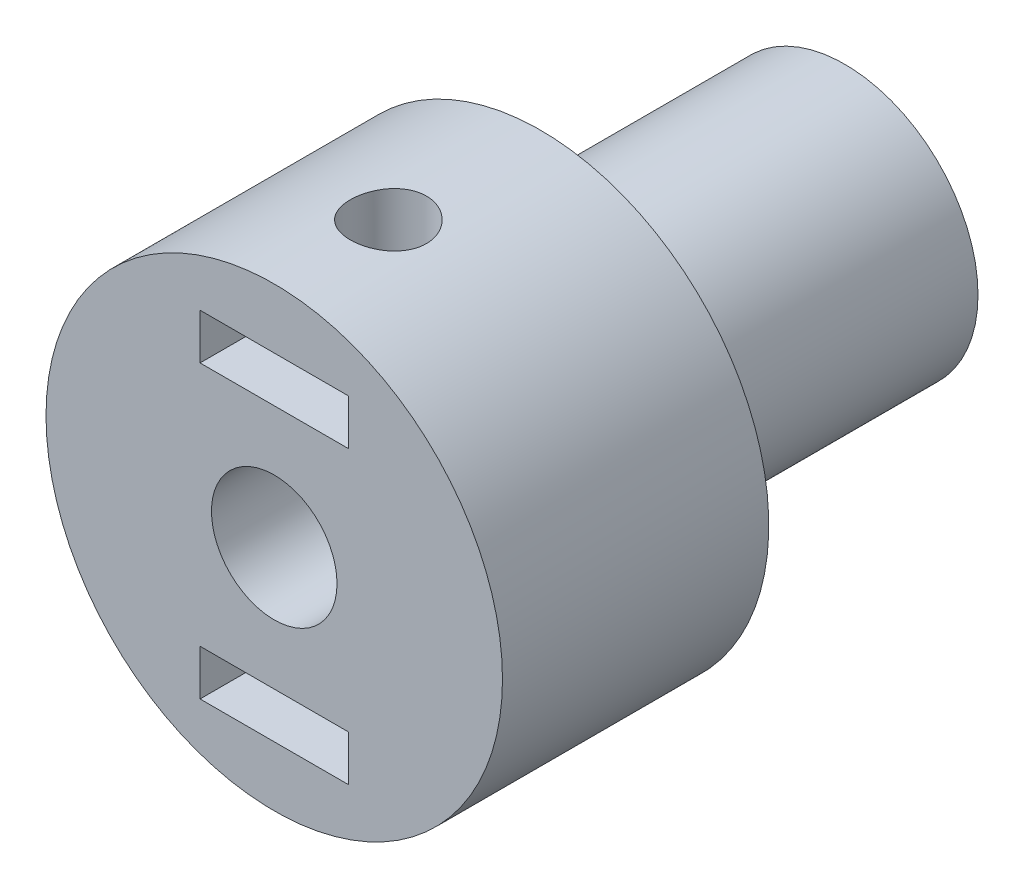
ISO-10303-21;
HEADER;
FILE_DESCRIPTION(('STEP AP214'),'2;1');
FILE_NAME('part.step','',(''),(''),'','','');
FILE_SCHEMA(('AUTOMOTIVE_DESIGN { 1 0 10303 214 1 1 1 1 }'));
ENDSEC;
DATA;
#1=APPLICATION_CONTEXT('core data for automotive mechanical design processes');
#2=APPLICATION_PROTOCOL_DEFINITION('international standard','automotive_design',2000,#1);
#3=PRODUCT_CONTEXT('',#1,'mechanical');
#4=PRODUCT('Part','Part','',(#3));
#5=PRODUCT_RELATED_PRODUCT_CATEGORY('part','',(#4));
#6=PRODUCT_DEFINITION_FORMATION('','',#4);
#7=PRODUCT_DEFINITION_CONTEXT('part definition',#1,'design');
#8=PRODUCT_DEFINITION('design','',#6,#7);
#9=PRODUCT_DEFINITION_SHAPE('','',#8);
#10=(LENGTH_UNIT() NAMED_UNIT(*) SI_UNIT(.MILLI.,.METRE.));
#11=(NAMED_UNIT(*) PLANE_ANGLE_UNIT() SI_UNIT($,.RADIAN.));
#12=(NAMED_UNIT(*) SI_UNIT($,.STERADIAN.) SOLID_ANGLE_UNIT());
#13=UNCERTAINTY_MEASURE_WITH_UNIT(LENGTH_MEASURE(1.E-05),#10,'distance_accuracy_value','');
#14=(GEOMETRIC_REPRESENTATION_CONTEXT(3) GLOBAL_UNCERTAINTY_ASSIGNED_CONTEXT((#13)) GLOBAL_UNIT_ASSIGNED_CONTEXT((#10,
#11,#12)) REPRESENTATION_CONTEXT('',''));
#15=CARTESIAN_POINT('',(0.,0.,0.));
#16=DIRECTION('',(0.,0.,1.));
#17=DIRECTION('',(1.,0.,0.));
#18=AXIS2_PLACEMENT_3D('',#15,#16,#17);
#19=CARTESIAN_POINT('',(0.,0.,15.));
#20=DIRECTION('',(0.,0.,-1.));
#21=DIRECTION('',(-1.,0.,0.));
#22=AXIS2_PLACEMENT_3D('',#19,#20,#21);
#23=CYLINDRICAL_SURFACE('',#22,6.);
#24=CARTESIAN_POINT('',(0.,0.,15.));
#25=DIRECTION('',(0.,0.,1.));
#26=DIRECTION('',(1.,0.,0.));
#27=AXIS2_PLACEMENT_3D('',#24,#25,#26);
#28=CIRCLE('',#27,6.);
#29=CARTESIAN_POINT('',(6.,0.,15.));
#30=VERTEX_POINT('',#29);
#31=EDGE_CURVE('E11',#30,#30,#28,.T.);
#32=ORIENTED_EDGE('',*,*,#31,.F.);
#33=EDGE_LOOP('',(#32));
#34=FACE_BOUND('',#33,.T.);
#35=CARTESIAN_POINT('',(0.,6.,13.));
#36=CARTESIAN_POINT('',(-0.0557563619832858,5.9999990446753,12.9999977644209));
#37=CARTESIAN_POINT('',(-0.111543152735528,5.99921471165214,12.9953210900124));
#38=CARTESIAN_POINT('',(-0.221552088669217,5.99616137976555,12.9767457364939));
#39=CARTESIAN_POINT('',(-0.275772747183699,5.99389101569556,12.9628385772354));
#40=CARTESIAN_POINT('',(-0.381041898885058,5.9881202729458,12.9262338205629));
#41=CARTESIAN_POINT('',(-0.432092947372761,5.98462090063677,12.9035434137438));
#42=CARTESIAN_POINT('',(-0.529656736791179,5.97677690832828,12.850035083179));
#43=CARTESIAN_POINT('',(-0.576169995951437,5.97243238501774,12.8192180890068));
#44=CARTESIAN_POINT('',(-0.663789045716672,5.96333326983325,12.7500179664718));
#45=CARTESIAN_POINT('',(-0.704845161413987,5.95857548725943,12.7115723541455));
#46=CARTESIAN_POINT('',(-0.779955399463972,5.94921050750693,12.6283408126109));
#47=CARTESIAN_POINT('',(-0.814009079756389,5.94460331985067,12.5835544834174));
#48=CARTESIAN_POINT('',(-0.874346850242054,5.93603026303912,12.4885716135212));
#49=CARTESIAN_POINT('',(-0.900581821144401,5.93206851636655,12.4383434652781));
#50=CARTESIAN_POINT('',(-0.944223346164488,5.9252791591787,12.3341161742797));
#51=CARTESIAN_POINT('',(-0.961630496626246,5.92245147205723,12.2801172865289));
#52=CARTESIAN_POINT('',(-0.986965751113924,5.91828214737102,12.1704078900574));
#53=CARTESIAN_POINT('',(-0.994979611654161,5.9169270739428,12.1147177053994));
#54=CARTESIAN_POINT('',(-1.00156669011595,5.9158157557466,12.0027678892466));
#55=CARTESIAN_POINT('',(-1.0001405761556,5.91605939782886,11.9465082983331));
#56=CARTESIAN_POINT('',(-0.987958039358461,5.91810571545422,11.8356288554898));
#57=CARTESIAN_POINT('',(-0.97729795275591,5.91989229327567,11.7809980785819));
#58=CARTESIAN_POINT('',(-0.947101256161378,5.92479798084403,11.6743114728683));
#59=CARTESIAN_POINT('',(-0.927564341727897,5.92791713629309,11.6222557324446));
#60=CARTESIAN_POINT('',(-0.880070898437566,5.9351539173364,11.5219084706236));
#61=CARTESIAN_POINT('',(-0.852074365551886,5.9392762684293,11.4736362375675));
#62=CARTESIAN_POINT('',(-0.788484807022973,5.94805167366004,11.3824382397846));
#63=CARTESIAN_POINT('',(-0.752891168261715,5.95270477061715,11.339512907018));
#64=CARTESIAN_POINT('',(-0.674592884863621,5.96208811151914,11.2596695656771));
#65=CARTESIAN_POINT('',(-0.631805585549251,5.96681859692661,11.222832592584));
#66=CARTESIAN_POINT('',(-0.540614099592659,5.97577040558689,11.1568488949339));
#67=CARTESIAN_POINT('',(-0.492209876762569,5.97999172555898,11.1277022199267));
#68=CARTESIAN_POINT('',(-0.391082366466685,5.98745557157165,11.0779191091455));
#69=CARTESIAN_POINT('',(-0.338355490225865,5.99069727362979,11.0572898322675));
#70=CARTESIAN_POINT('',(-0.230119338241093,5.99583001205064,11.0252023139016));
#71=CARTESIAN_POINT('',(-0.174610295671787,5.9977211614019,11.0137433052105));
#72=CARTESIAN_POINT('',(-0.063083960520649,5.99992451937074,11.0004314566155));
#73=CARTESIAN_POINT('',(-0.00708029486040398,6.00025501205114,10.9984673712778));
#74=CARTESIAN_POINT('',(0.104455909155955,5.99934989768468,11.0039045377712));
#75=CARTESIAN_POINT('',(0.159988465556816,5.99811435089647,11.0113054292535));
#76=CARTESIAN_POINT('',(0.268662470218706,5.99422730775281,11.0351699397342));
#77=CARTESIAN_POINT('',(0.321816347354152,5.99158441920524,11.051578483356));
#78=CARTESIAN_POINT('',(0.424618753944177,5.98517785782144,11.0929338072798));
#79=CARTESIAN_POINT('',(0.474267086363888,5.98141412204808,11.1178810670541));
#80=CARTESIAN_POINT('',(0.569132275787584,5.97313806520963,11.1758604498787));
#81=CARTESIAN_POINT('',(0.614306100374859,5.96861942354809,11.2089620624669));
#82=CARTESIAN_POINT('',(0.698497434201076,5.9593538695676,11.282214926154));
#83=CARTESIAN_POINT('',(0.737514495878634,5.95460694068619,11.3223666893107));
#84=CARTESIAN_POINT('',(0.808697111863201,5.94536070094338,11.4090790192286));
#85=CARTESIAN_POINT('',(0.840787504445486,5.94086446454842,11.4557016662058));
#86=CARTESIAN_POINT('',(0.896680924117994,5.93268611911154,11.5537411876554));
#87=CARTESIAN_POINT('',(0.920484213907929,5.92900398426408,11.605157910091));
#88=CARTESIAN_POINT('',(0.95901533258926,5.92289381479082,11.7111158931249));
#89=CARTESIAN_POINT('',(0.973780573019179,5.92046061724426,11.7656432380122));
#90=CARTESIAN_POINT('',(0.993934181511311,5.91711086734105,11.8764480516887));
#91=CARTESIAN_POINT('',(0.999323364778468,5.91619418313089,11.9327253678928));
#92=CARTESIAN_POINT('',(1.00054914641894,5.91598693233605,12.044682066385));
#93=CARTESIAN_POINT('',(0.996504054450075,5.9166762260226,12.1003601514301));
#94=CARTESIAN_POINT('',(0.97923193558274,5.91955912581491,12.2102316992203));
#95=CARTESIAN_POINT('',(0.966004938444991,5.92175272704486,12.2644251667767));
#96=CARTESIAN_POINT('',(0.930789795837961,5.92738942512688,12.369743374917));
#97=CARTESIAN_POINT('',(0.908811836240178,5.93083106887868,12.4208716040224));
#98=CARTESIAN_POINT('',(0.856730801566365,5.93857747568883,12.5187342676779));
#99=CARTESIAN_POINT('',(0.826627323499426,5.9428822815536,12.5654684841489));
#100=CARTESIAN_POINT('',(0.758727553748862,5.95193381618249,12.6538142332431));
#101=CARTESIAN_POINT('',(0.720844225437459,5.95668518230521,12.6953584066801));
#102=CARTESIAN_POINT('',(0.638643612552092,5.96605748944336,12.77154064179));
#103=CARTESIAN_POINT('',(0.594324845165055,5.97067840010619,12.8061771074553));
#104=CARTESIAN_POINT('',(0.500147667856113,5.97930611856888,12.86777930728));
#105=CARTESIAN_POINT('',(0.450253115013127,5.98330846501242,12.8946904157252));
#106=CARTESIAN_POINT('',(0.346605227751592,5.9902046704071,12.939707793844));
#107=CARTESIAN_POINT('',(0.292855797932004,5.99309963270993,12.9578228324319));
#108=CARTESIAN_POINT('',(0.19908132401816,5.99682316333182,12.9808021096507));
#109=CARTESIAN_POINT('',(0.159623532119379,5.99800810909344,12.9879897878464));
#110=CARTESIAN_POINT('',(0.0801157241279235,5.99959686394448,12.9975894951379));
#111=CARTESIAN_POINT('',(0.0400657182433976,6.00000068648257,13.0000016064549));
#112=CARTESIAN_POINT('',(0.,6.,13.));
#113=B_SPLINE_CURVE_WITH_KNOTS('',3,(#35,#36,#37,#38,#39,#40,#41,#42,#43,#44,#45,#46,#47,#48,
#49,#50,#51,#52,#53,#54,#55,#56,#57,#58,#59,#60,#61,#62,#63,#64,#65,#66,#67,#68,#69,#70,#71,#72,
#73,#74,#75,#76,#77,#78,#79,#80,#81,#82,#83,#84,#85,#86,#87,#88,#89,#90,#91,#92,#93,#94,#95,#96,
#97,#98,#99,#100,#101,#102,#103,#104,#105,#106,#107,#108,#109,#110,#111,#112),.UNSPECIFIED.,.T.,
.F.,(4,2,2,2,2,2,2,2,2,2,2,2,2,2,2,2,2,2,2,2,2,2,2,2,2,2,2,2,2,2,2,2,2,2,2,2,2,2,4),(0.,
0.167122633975404,0.334399018278169,0.50153874681011,0.668659365069917,0.837209964249329,
1.00577120067943,1.17537008329536,1.34495750750473,1.5129843084137,1.68099921728355,
1.84728208704163,2.01357066010152,2.18065822653023,2.3477592827223,2.51693107964531,
2.68610396654339,2.85541875566361,3.0247193780846,3.19203153396559,3.35933725214344,
3.52563122802566,3.69193454330427,3.8597073025081,4.02749225221713,4.19701528803048,
4.36653294950377,4.53534408936709,4.70414055114647,4.8708316380908,5.03752218475253,
5.20401927290489,5.37052462011735,5.53900553677357,5.70752533551589,5.8772089264288,
6.04672300852029,6.16681699265608,6.28690890910787),.UNSPECIFIED.);
#114=CARTESIAN_POINT('',(0.,6.,13.));
#115=VERTEX_POINT('',#114);
#116=EDGE_CURVE('E187',#115,#115,#113,.T.);
#117=ORIENTED_EDGE('',*,*,#116,.T.);
#118=EDGE_LOOP('',(#117));
#119=FACE_BOUND('',#118,.T.);
#120=CARTESIAN_POINT('',(0.,-6.,13.));
#121=CARTESIAN_POINT('',(0.0557563619832858,-5.9999990446753,12.9999977644209));
#122=CARTESIAN_POINT('',(0.111543152735528,-5.99921471165214,12.9953210900124));
#123=CARTESIAN_POINT('',(0.221552088669217,-5.99616137976555,12.9767457364939));
#124=CARTESIAN_POINT('',(0.275772747183699,-5.99389101569556,12.9628385772354));
#125=CARTESIAN_POINT('',(0.381041898885058,-5.9881202729458,12.9262338205629));
#126=CARTESIAN_POINT('',(0.432092947372761,-5.98462090063677,12.9035434137438));
#127=CARTESIAN_POINT('',(0.529656736791179,-5.97677690832828,12.850035083179));
#128=CARTESIAN_POINT('',(0.576169995951437,-5.97243238501774,12.8192180890068));
#129=CARTESIAN_POINT('',(0.663789045716672,-5.96333326983325,12.7500179664718));
#130=CARTESIAN_POINT('',(0.704845161413987,-5.95857548725943,12.7115723541455));
#131=CARTESIAN_POINT('',(0.779955399463972,-5.94921050750693,12.6283408126109));
#132=CARTESIAN_POINT('',(0.814009079756389,-5.94460331985067,12.5835544834174));
#133=CARTESIAN_POINT('',(0.874346850242054,-5.93603026303912,12.4885716135212));
#134=CARTESIAN_POINT('',(0.900581821144401,-5.93206851636655,12.4383434652781));
#135=CARTESIAN_POINT('',(0.944223346164488,-5.9252791591787,12.3341161742797));
#136=CARTESIAN_POINT('',(0.961630496626246,-5.92245147205723,12.2801172865289));
#137=CARTESIAN_POINT('',(0.986965751113924,-5.91828214737102,12.1704078900574));
#138=CARTESIAN_POINT('',(0.994979611654161,-5.9169270739428,12.1147177053994));
#139=CARTESIAN_POINT('',(1.00156669011595,-5.9158157557466,12.0027678892466));
#140=CARTESIAN_POINT('',(1.0001405761556,-5.91605939782886,11.9465082983331));
#141=CARTESIAN_POINT('',(0.987958039358461,-5.91810571545422,11.8356288554898));
#142=CARTESIAN_POINT('',(0.97729795275591,-5.91989229327567,11.7809980785819));
#143=CARTESIAN_POINT('',(0.947101256161378,-5.92479798084403,11.6743114728683));
#144=CARTESIAN_POINT('',(0.927564341727897,-5.92791713629309,11.6222557324446));
#145=CARTESIAN_POINT('',(0.880070898437566,-5.9351539173364,11.5219084706236));
#146=CARTESIAN_POINT('',(0.852074365551886,-5.9392762684293,11.4736362375675));
#147=CARTESIAN_POINT('',(0.788484807022973,-5.94805167366004,11.3824382397846));
#148=CARTESIAN_POINT('',(0.752891168261715,-5.95270477061715,11.339512907018));
#149=CARTESIAN_POINT('',(0.674592884863621,-5.96208811151914,11.2596695656771));
#150=CARTESIAN_POINT('',(0.631805585549251,-5.96681859692661,11.222832592584));
#151=CARTESIAN_POINT('',(0.540614099592659,-5.97577040558689,11.1568488949339));
#152=CARTESIAN_POINT('',(0.492209876762569,-5.97999172555898,11.1277022199267));
#153=CARTESIAN_POINT('',(0.391082366466685,-5.98745557157165,11.0779191091455));
#154=CARTESIAN_POINT('',(0.338355490225865,-5.99069727362979,11.0572898322675));
#155=CARTESIAN_POINT('',(0.230119338241093,-5.99583001205064,11.0252023139016));
#156=CARTESIAN_POINT('',(0.174610295671787,-5.9977211614019,11.0137433052105));
#157=CARTESIAN_POINT('',(0.063083960520649,-5.99992451937074,11.0004314566155));
#158=CARTESIAN_POINT('',(0.00708029486040398,-6.00025501205114,10.9984673712778));
#159=CARTESIAN_POINT('',(-0.104455909155955,-5.99934989768468,11.0039045377712));
#160=CARTESIAN_POINT('',(-0.159988465556816,-5.99811435089647,11.0113054292535));
#161=CARTESIAN_POINT('',(-0.268662470218706,-5.99422730775281,11.0351699397342));
#162=CARTESIAN_POINT('',(-0.321816347354152,-5.99158441920524,11.051578483356));
#163=CARTESIAN_POINT('',(-0.424618753944177,-5.98517785782144,11.0929338072798));
#164=CARTESIAN_POINT('',(-0.474267086363888,-5.98141412204808,11.1178810670541));
#165=CARTESIAN_POINT('',(-0.569132275787584,-5.97313806520963,11.1758604498787));
#166=CARTESIAN_POINT('',(-0.614306100374859,-5.96861942354809,11.2089620624669));
#167=CARTESIAN_POINT('',(-0.698497434201076,-5.9593538695676,11.282214926154));
#168=CARTESIAN_POINT('',(-0.737514495878634,-5.95460694068619,11.3223666893107));
#169=CARTESIAN_POINT('',(-0.808697111863201,-5.94536070094338,11.4090790192286));
#170=CARTESIAN_POINT('',(-0.840787504445486,-5.94086446454842,11.4557016662058));
#171=CARTESIAN_POINT('',(-0.896680924117994,-5.93268611911154,11.5537411876554));
#172=CARTESIAN_POINT('',(-0.920484213907929,-5.92900398426408,11.605157910091));
#173=CARTESIAN_POINT('',(-0.95901533258926,-5.92289381479082,11.7111158931249));
#174=CARTESIAN_POINT('',(-0.973780573019179,-5.92046061724426,11.7656432380122));
#175=CARTESIAN_POINT('',(-0.993934181511311,-5.91711086734105,11.8764480516887));
#176=CARTESIAN_POINT('',(-0.999323364778468,-5.91619418313089,11.9327253678928));
#177=CARTESIAN_POINT('',(-1.00054914641894,-5.91598693233605,12.044682066385));
#178=CARTESIAN_POINT('',(-0.996504054450075,-5.9166762260226,12.1003601514301));
#179=CARTESIAN_POINT('',(-0.97923193558274,-5.91955912581491,12.2102316992203));
#180=CARTESIAN_POINT('',(-0.966004938444991,-5.92175272704486,12.2644251667767));
#181=CARTESIAN_POINT('',(-0.930789795837961,-5.92738942512688,12.369743374917));
#182=CARTESIAN_POINT('',(-0.908811836240178,-5.93083106887868,12.4208716040224));
#183=CARTESIAN_POINT('',(-0.856730801566365,-5.93857747568883,12.5187342676779));
#184=CARTESIAN_POINT('',(-0.826627323499426,-5.9428822815536,12.5654684841489));
#185=CARTESIAN_POINT('',(-0.758727553748862,-5.95193381618249,12.6538142332431));
#186=CARTESIAN_POINT('',(-0.720844225437459,-5.95668518230521,12.6953584066801));
#187=CARTESIAN_POINT('',(-0.638643612552092,-5.96605748944336,12.77154064179));
#188=CARTESIAN_POINT('',(-0.594324845165055,-5.97067840010619,12.8061771074553));
#189=CARTESIAN_POINT('',(-0.500147667856113,-5.97930611856888,12.86777930728));
#190=CARTESIAN_POINT('',(-0.450253115013127,-5.98330846501242,12.8946904157252));
#191=CARTESIAN_POINT('',(-0.346605227751592,-5.9902046704071,12.939707793844));
#192=CARTESIAN_POINT('',(-0.292855797932004,-5.99309963270993,12.9578228324319));
#193=CARTESIAN_POINT('',(-0.19908132401816,-5.99682316333182,12.9808021096507));
#194=CARTESIAN_POINT('',(-0.159623532119379,-5.99800810909344,12.9879897878464));
#195=CARTESIAN_POINT('',(-0.0801157241279235,-5.99959686394448,12.9975894951379));
#196=CARTESIAN_POINT('',(-0.0400657182433976,-6.00000068648257,13.0000016064549));
#197=CARTESIAN_POINT('',(0.,-6.,13.));
#198=B_SPLINE_CURVE_WITH_KNOTS('',3,(#120,#121,#122,#123,#124,#125,#126,#127,#128,#129,#130,
#131,#132,#133,#134,#135,#136,#137,#138,#139,#140,#141,#142,#143,#144,#145,#146,#147,#148,#149,
#150,#151,#152,#153,#154,#155,#156,#157,#158,#159,#160,#161,#162,#163,#164,#165,#166,#167,#168,
#169,#170,#171,#172,#173,#174,#175,#176,#177,#178,#179,#180,#181,#182,#183,#184,#185,#186,#187,
#188,#189,#190,#191,#192,#193,#194,#195,#196,#197),.UNSPECIFIED.,.T.,.F.,(4,2,2,2,2,2,2,2,2,2,2,
2,2,2,2,2,2,2,2,2,2,2,2,2,2,2,2,2,2,2,2,2,2,2,2,2,2,2,4),(0.,0.167122633975404,
0.334399018278169,0.50153874681011,0.668659365069917,0.837209964249329,1.00577120067943,
1.17537008329536,1.34495750750473,1.5129843084137,1.68099921728355,1.84728208704163,
2.01357066010152,2.18065822653023,2.3477592827223,2.51693107964531,2.68610396654339,
2.85541875566361,3.0247193780846,3.19203153396559,3.35933725214344,3.52563122802566,
3.69193454330427,3.8597073025081,4.02749225221713,4.19701528803048,4.36653294950377,
4.53534408936709,4.70414055114647,4.8708316380908,5.03752218475253,5.20401927290489,
5.37052462011735,5.53900553677357,5.70752533551589,5.8772089264288,6.04672300852029,
6.16681699265608,6.28690890910787),.UNSPECIFIED.);
#199=CARTESIAN_POINT('',(0.,-6.,13.));
#200=VERTEX_POINT('',#199);
#201=EDGE_CURVE('E192',#200,#200,#198,.T.);
#202=ORIENTED_EDGE('',*,*,#201,.T.);
#203=EDGE_LOOP('',(#202));
#204=FACE_BOUND('',#203,.T.);
#205=CARTESIAN_POINT('',(0.,0.,8.));
#206=DIRECTION('',(0.,0.,-1.));
#207=DIRECTION('',(-1.,0.,0.));
#208=AXIS2_PLACEMENT_3D('',#205,#206,#207);
#209=CIRCLE('',#208,6.);
#210=CARTESIAN_POINT('',(-6.,0.,8.));
#211=VERTEX_POINT('',#210);
#212=EDGE_CURVE('E140',#211,#211,#209,.T.);
#213=ORIENTED_EDGE('',*,*,#212,.F.);
#214=EDGE_LOOP('',(#213));
#215=FACE_BOUND('',#214,.T.);
#216=ADVANCED_FACE('F39',(#34,#119,#204,#215),#23,.T.);
#217=CARTESIAN_POINT('',(0.,0.,0.));
#218=DIRECTION('',(0.,0.,1.));
#219=DIRECTION('',(1.,0.,0.));
#220=AXIS2_PLACEMENT_3D('',#217,#218,#219);
#221=PLANE('',#220);
#222=CARTESIAN_POINT('',(0.,0.,0.));
#223=DIRECTION('',(0.,0.,1.));
#224=DIRECTION('',(1.,0.,0.));
#225=AXIS2_PLACEMENT_3D('',#222,#223,#224);
#226=CIRCLE('',#225,1.65);
#227=CARTESIAN_POINT('',(1.65,0.,0.));
#228=VERTEX_POINT('',#227);
#229=EDGE_CURVE('E48',#228,#228,#226,.T.);
#230=ORIENTED_EDGE('',*,*,#229,.T.);
#231=EDGE_LOOP('',(#230));
#232=FACE_BOUND('',#231,.T.);
#233=CARTESIAN_POINT('',(0.,0.,0.));
#234=DIRECTION('',(0.,0.,-1.));
#235=DIRECTION('',(-1.,0.,0.));
#236=AXIS2_PLACEMENT_3D('',#233,#234,#235);
#237=CIRCLE('',#236,3.5);
#238=CARTESIAN_POINT('',(-3.5,0.,0.));
#239=VERTEX_POINT('',#238);
#240=EDGE_CURVE('E133',#239,#239,#237,.T.);
#241=ORIENTED_EDGE('',*,*,#240,.T.);
#242=EDGE_LOOP('',(#241));
#243=FACE_BOUND('',#242,.T.);
#244=ADVANCED_FACE('F253',(#232,#243),#221,.F.);
#245=CARTESIAN_POINT('',(0.,0.,15.));
#246=DIRECTION('',(0.,0.,1.));
#247=DIRECTION('',(1.,0.,0.));
#248=AXIS2_PLACEMENT_3D('',#245,#246,#247);
#249=PLANE('',#248);
#250=DIRECTION('',(0.,1.,0.));
#251=VECTOR('',#250,1.);
#252=CARTESIAN_POINT('',(1.95,4.425,15.));
#253=LINE('',#252,#251);
#254=CARTESIAN_POINT('',(1.95,3.225,15.));
#255=VERTEX_POINT('',#254);
#256=CARTESIAN_POINT('',(1.95,4.425,15.));
#257=VERTEX_POINT('',#256);
#258=EDGE_CURVE('E64',#255,#257,#253,.T.);
#259=ORIENTED_EDGE('',*,*,#258,.F.);
#260=DIRECTION('',(1.,0.,0.));
#261=VECTOR('',#260,1.);
#262=CARTESIAN_POINT('',(-1.95,3.225,15.));
#263=LINE('',#262,#261);
#264=CARTESIAN_POINT('',(-1.95,3.225,15.));
#265=VERTEX_POINT('',#264);
#266=EDGE_CURVE('E202',#265,#255,#263,.T.);
#267=ORIENTED_EDGE('',*,*,#266,.F.);
#268=DIRECTION('',(0.,-1.,0.));
#269=VECTOR('',#268,1.);
#270=CARTESIAN_POINT('',(-1.95,4.425,15.));
#271=LINE('',#270,#269);
#272=CARTESIAN_POINT('',(-1.95,4.425,15.));
#273=VERTEX_POINT('',#272);
#274=EDGE_CURVE('E216',#273,#265,#271,.T.);
#275=ORIENTED_EDGE('',*,*,#274,.F.);
#276=DIRECTION('',(-1.,0.,0.));
#277=VECTOR('',#276,1.);
#278=CARTESIAN_POINT('',(-1.95,4.425,15.));
#279=LINE('',#278,#277);
#280=EDGE_CURVE('E213',#257,#273,#279,.T.);
#281=ORIENTED_EDGE('',*,*,#280,.F.);
#282=EDGE_LOOP('',(#259,#267,#275,#281));
#283=FACE_BOUND('',#282,.T.);
#284=CARTESIAN_POINT('',(0.,0.,15.));
#285=DIRECTION('',(0.,0.,1.));
#286=DIRECTION('',(1.,0.,0.));
#287=AXIS2_PLACEMENT_3D('',#284,#285,#286);
#288=CIRCLE('',#287,1.65);
#289=CARTESIAN_POINT('',(1.65,0.,15.));
#290=VERTEX_POINT('',#289);
#291=EDGE_CURVE('E223',#290,#290,#288,.T.);
#292=ORIENTED_EDGE('',*,*,#291,.F.);
#293=EDGE_LOOP('',(#292));
#294=FACE_BOUND('',#293,.T.);
#295=ORIENTED_EDGE('',*,*,#31,.T.);
#296=EDGE_LOOP('',(#295));
#297=FACE_BOUND('',#296,.T.);
#298=DIRECTION('',(1.,0.,0.));
#299=VECTOR('',#298,1.);
#300=CARTESIAN_POINT('',(-1.95,-3.225,15.));
#301=LINE('',#300,#299);
#302=CARTESIAN_POINT('',(-1.95,-3.225,15.));
#303=VERTEX_POINT('',#302);
#304=CARTESIAN_POINT('',(1.95,-3.225,15.));
#305=VERTEX_POINT('',#304);
#306=EDGE_CURVE('E139',#303,#305,#301,.T.);
#307=ORIENTED_EDGE('',*,*,#306,.T.);
#308=DIRECTION('',(0.,-1.,0.));
#309=VECTOR('',#308,1.);
#310=CARTESIAN_POINT('',(1.95,-4.425,15.));
#311=LINE('',#310,#309);
#312=CARTESIAN_POINT('',(1.95,-4.425,15.));
#313=VERTEX_POINT('',#312);
#314=EDGE_CURVE('E56',#305,#313,#311,.T.);
#315=ORIENTED_EDGE('',*,*,#314,.T.);
#316=DIRECTION('',(-1.,0.,0.));
#317=VECTOR('',#316,1.);
#318=CARTESIAN_POINT('',(-1.95,-4.425,15.));
#319=LINE('',#318,#317);
#320=CARTESIAN_POINT('',(-1.95,-4.425,15.));
#321=VERTEX_POINT('',#320);
#322=EDGE_CURVE('E127',#313,#321,#319,.T.);
#323=ORIENTED_EDGE('',*,*,#322,.T.);
#324=DIRECTION('',(0.,1.,0.));
#325=VECTOR('',#324,1.);
#326=CARTESIAN_POINT('',(-1.95,-4.425,15.));
#327=LINE('',#326,#325);
#328=EDGE_CURVE('E130',#321,#303,#327,.T.);
#329=ORIENTED_EDGE('',*,*,#328,.T.);
#330=EDGE_LOOP('',(#307,#315,#323,#329));
#331=FACE_BOUND('',#330,.T.);
#332=ADVANCED_FACE('F177',(#283,#294,#297,#331),#249,.T.);
#333=CARTESIAN_POINT('',(0.,-7.5,12.));
#334=DIRECTION('',(0.,1.,0.));
#335=DIRECTION('',(0.,0.,1.));
#336=AXIS2_PLACEMENT_3D('',#333,#334,#335);
#337=CYLINDRICAL_SURFACE('',#336,1.);
#338=ORIENTED_EDGE('',*,*,#201,.F.);
#339=EDGE_LOOP('',(#338));
#340=FACE_BOUND('',#339,.T.);
#341=CARTESIAN_POINT('',(0.,-4.425,12.));
#342=DIRECTION('',(0.,1.,0.));
#343=DIRECTION('',(0.,0.,1.));
#344=AXIS2_PLACEMENT_3D('',#341,#342,#343);
#345=CIRCLE('',#344,1.);
#346=CARTESIAN_POINT('',(0.,-4.425,13.));
#347=VERTEX_POINT('',#346);
#348=EDGE_CURVE('E43',#347,#347,#345,.F.);
#349=ORIENTED_EDGE('',*,*,#348,.F.);
#350=EDGE_LOOP('',(#349));
#351=FACE_BOUND('',#350,.T.);
#352=ADVANCED_FACE('F171',(#340,#351),#337,.F.);
#353=CARTESIAN_POINT('',(0.,-1.65,13.));
#354=CARTESIAN_POINT('',(-0.0510702587522871,-1.64999725462599,12.9999970120308));
#355=CARTESIAN_POINT('',(-0.102217149878792,-1.64760334711921,12.9960605643478));
#356=CARTESIAN_POINT('',(-0.202965346690547,-1.63825479016592,12.9805182199891));
#357=CARTESIAN_POINT('',(-0.252562758561856,-1.63128948912386,12.9688944108566));
#358=CARTESIAN_POINT('',(-0.348541987106506,-1.61350220489552,12.9386362299579));
#359=CARTESIAN_POINT('',(-0.394938419455794,-1.6026993587467,12.9200366198344));
#360=CARTESIAN_POINT('',(-0.483802479340023,-1.57815185303198,12.8765753114205));
#361=CARTESIAN_POINT('',(-0.526270945838939,-1.56440782375348,12.8517149545892));
#362=CARTESIAN_POINT('',(-0.609789674957084,-1.5338783382277,12.7943046726873));
#363=CARTESIAN_POINT('',(-0.650476421731218,-1.51693988962828,12.7613088305275));
#364=CARTESIAN_POINT('',(-0.726092976313257,-1.48223611452274,12.6895725229135));
#365=CARTESIAN_POINT('',(-0.761015191454281,-1.4644697363765,12.6508246067168));
#366=CARTESIAN_POINT('',(-0.828566961798418,-1.42745845203689,12.56295953534));
#367=CARTESIAN_POINT('',(-0.860356799572737,-1.40830834271854,12.5131512175401));
#368=CARTESIAN_POINT('',(-0.915001501300726,-1.37343623436034,12.407773831237));
#369=CARTESIAN_POINT('',(-0.93787102927903,-1.3577086280773,12.3522144088536));
#370=CARTESIAN_POINT('',(-0.96910583285675,-1.33551749434895,12.2508278940883));
#371=CARTESIAN_POINT('',(-0.979654517784185,-1.32772708728687,12.2059652941112));
#372=CARTESIAN_POINT('',(-0.994472917581166,-1.31666714586982,12.1146916620869));
#373=CARTESIAN_POINT('',(-0.998750686824152,-1.31339181267048,12.0682826947354));
#374=CARTESIAN_POINT('',(-1.00077791844552,-1.31184824480552,11.975138109467));
#375=CARTESIAN_POINT('',(-0.998513610037681,-1.3135905720699,11.9284020093946));
#376=CARTESIAN_POINT('',(-0.987573709992293,-1.32183295234365,11.8361045470503));
#377=CARTESIAN_POINT('',(-0.978893213812438,-1.3283366449106,11.7905441110444));
#378=CARTESIAN_POINT('',(-0.955770018341793,-1.34506536918651,11.7024267254822));
#379=CARTESIAN_POINT('',(-0.941416580666364,-1.35523254815816,11.65983473783));
#380=CARTESIAN_POINT('',(-0.907482692585413,-1.37818499767072,11.5775569228166));
#381=CARTESIAN_POINT('',(-0.887900343870036,-1.39097121863822,11.5378721575778));
#382=CARTESIAN_POINT('',(-0.84005423169509,-1.42046851859231,11.4550359460823));
#383=CARTESIAN_POINT('',(-0.810865929657931,-1.43747321528451,11.4125228995165));
#384=CARTESIAN_POINT('',(-0.746426363600609,-1.47196671725487,11.3325505213372));
#385=CARTESIAN_POINT('',(-0.71116918567903,-1.48945598064548,11.2950961833916));
#386=CARTESIAN_POINT('',(-0.629512563044835,-1.52593924211837,11.2207785686766));
#387=CARTESIAN_POINT('',(-0.582238516113698,-1.54478270877129,11.1847917022795));
#388=CARTESIAN_POINT('',(-0.481182265938953,-1.57917891825272,11.1213558110158));
#389=CARTESIAN_POINT('',(-0.427403373935146,-1.59473332436144,11.0939024674234));
#390=CARTESIAN_POINT('',(-0.318129297683025,-1.6199507716119,11.0502432394718));
#391=CARTESIAN_POINT('',(-0.262940885394132,-1.62991625473412,11.0334515416477));
#392=CARTESIAN_POINT('',(-0.149812231718699,-1.64416909832352,11.0096031626348));
#393=CARTESIAN_POINT('',(-0.0918755222623559,-1.64846355243775,11.0025343190831));
#394=CARTESIAN_POINT('',(0.0163543460103998,-1.65068164397369,10.9988761835703));
#395=CARTESIAN_POINT('',(0.0665917454303284,-1.64940712778978,11.0009680017728));
#396=CARTESIAN_POINT('',(0.165874318614697,-1.64239473886529,11.0125880576123));
#397=CARTESIAN_POINT('',(0.214919528502543,-1.63665700153484,11.0221160696418));
#398=CARTESIAN_POINT('',(0.309128767620511,-1.62146744931815,11.0477608561194));
#399=CARTESIAN_POINT('',(0.354362650484111,-1.61212283669974,11.0636879526382));
#400=CARTESIAN_POINT('',(0.441497745415157,-1.59047083581742,11.1014806570123));
#401=CARTESIAN_POINT('',(0.483398324971639,-1.57816288702129,11.1233473884843));
#402=CARTESIAN_POINT('',(0.567362493000936,-1.55008271934022,11.1749107668899));
#403=CARTESIAN_POINT('',(0.608995760769587,-1.53408397345293,11.2051829233915));
#404=CARTESIAN_POINT('',(0.686902247742362,-1.50082102685085,11.2714496356994));
#405=CARTESIAN_POINT('',(0.723169171451208,-1.48355537482552,11.3074508113524));
#406=CARTESIAN_POINT('',(0.794328333799578,-1.44684152422528,11.3897643010001));
#407=CARTESIAN_POINT('',(0.828384170197505,-1.42741110370506,11.4368119290038));
#408=CARTESIAN_POINT('',(0.888157958014536,-1.39100744737065,11.5367948045438));
#409=CARTESIAN_POINT('',(0.913884042590112,-1.37403182371588,11.5897242408339));
#410=CARTESIAN_POINT('',(0.951403571670489,-1.34823392726647,11.6885658267462));
#411=CARTESIAN_POINT('',(0.965004033193569,-1.33844317822648,11.7335362472528));
#412=CARTESIAN_POINT('',(0.985805464841424,-1.32319960254185,11.825621014635));
#413=CARTESIAN_POINT('',(0.993015615687183,-1.3177405538902,11.8727321832737));
#414=CARTESIAN_POINT('',(1.00063515744625,-1.31196601086183,11.968030194207));
#415=CARTESIAN_POINT('',(1.00101600857459,-1.3116721018124,12.0162207083434));
#416=CARTESIAN_POINT('',(0.994875262334804,-1.31633437321533,12.1119121782695));
#417=CARTESIAN_POINT('',(0.988350167188739,-1.32129321412285,12.1594127722649));
#418=CARTESIAN_POINT('',(0.969355772813774,-1.33528135131052,12.249725269678));
#419=CARTESIAN_POINT('',(0.957236911680788,-1.34406916082996,12.2926510433563));
#420=CARTESIAN_POINT('',(0.927720474052907,-1.36460868202592,12.3758814208486));
#421=CARTESIAN_POINT('',(0.910320886477174,-1.3763615225992,12.416185018935));
#422=CARTESIAN_POINT('',(0.867701177785744,-1.40368340419461,12.4996106035258));
#423=CARTESIAN_POINT('',(0.84169389292545,-1.41956101231027,12.5422281573915));
#424=CARTESIAN_POINT('',(0.783863774285927,-1.45229592595885,12.6229165869783));
#425=CARTESIAN_POINT('',(0.752036124211441,-1.46915403490917,12.660983653753));
#426=CARTESIAN_POINT('',(0.677058534990445,-1.50535955554259,12.738216307717));
#427=CARTESIAN_POINT('',(0.632902845742259,-1.52463721523986,12.7764476314008));
#428=CARTESIAN_POINT('',(0.537883385586757,-1.56069252552651,12.8450515506548));
#429=CARTESIAN_POINT('',(0.487016847686311,-1.5774691387827,12.8754208892158));
#430=CARTESIAN_POINT('',(0.380933288117642,-1.60634371332032,12.9264294205003));
#431=CARTESIAN_POINT('',(0.325846820194383,-1.6185424885953,12.9472807788386));
#432=CARTESIAN_POINT('',(0.212072608753963,-1.63732035840271,12.979022119554));
#433=CARTESIAN_POINT('',(0.153399146495504,-1.64392035770137,12.9899491683183));
#434=CARTESIAN_POINT('',(0.0785242920014497,-1.64820607285034,12.9970372409178));
#435=CARTESIAN_POINT('',(0.0628501764699296,-1.64887744346372,12.9981468140811));
#436=CARTESIAN_POINT('',(0.0314531321193296,-1.64977483981269,12.9996286702941));
#437=CARTESIAN_POINT('',(0.0157302011459247,-1.65000084560538,13.0000009203274));
#438=CARTESIAN_POINT('',(0.,-1.65,13.));
#439=B_SPLINE_CURVE_WITH_KNOTS('',3,(#353,#354,#355,#356,#357,#358,#359,#360,#361,#362,#363,
#364,#365,#366,#367,#368,#369,#370,#371,#372,#373,#374,#375,#376,#377,#378,#379,#380,#381,#382,
#383,#384,#385,#386,#387,#388,#389,#390,#391,#392,#393,#394,#395,#396,#397,#398,#399,#400,#401,
#402,#403,#404,#405,#406,#407,#408,#409,#410,#411,#412,#413,#414,#415,#416,#417,#418,#419,#420,
#421,#422,#423,#424,#425,#426,#427,#428,#429,#430,#431,#432,#433,#434,#435,#436,#437,#438),
.UNSPECIFIED.,.T.,.F.,(4,2,2,2,2,2,2,2,2,2,2,2,2,2,2,2,2,2,2,2,2,2,2,2,2,2,2,2,2,2,2,2,2,2,2,2,
2,2,2,2,2,2,4),(0.,0.153143677884662,0.306645461787433,0.459392268898896,0.612106375512792,
0.776627717002673,0.941364055464622,1.12680391219207,1.31193762796895,1.45156621419628,
1.59101530364952,1.73075814103099,1.8706079086329,2.00833960519984,2.14612137218316,
2.30840368089654,2.47084503251755,2.65688613723454,2.84283293463906,3.01739286029685,
3.19173422894814,3.34186652550671,3.49199426736408,3.63796645665455,3.7839662791537,
3.94504862329463,4.10631846698896,4.28921279206102,4.47192799708439,4.61531556586264,
4.75849679957718,4.90227625182894,5.04612856149287,5.18198766654628,5.31789857644585,
5.47449174603769,5.63121508616077,5.81485604819718,5.99857296644894,6.17796637053238,
6.35668696794116,6.40385479227047,6.45102472867195),.UNSPECIFIED.);
#440=CARTESIAN_POINT('',(0.,-1.65,13.));
#441=VERTEX_POINT('',#440);
#442=EDGE_CURVE('E162',#441,#441,#439,.T.);
#443=ORIENTED_EDGE('',*,*,#442,.F.);
#444=EDGE_LOOP('',(#443));
#445=FACE_BOUND('',#444,.T.);
#446=CARTESIAN_POINT('',(0.,-3.225,12.));
#447=DIRECTION('',(0.,-1.,0.));
#448=DIRECTION('',(0.,0.,-1.));
#449=AXIS2_PLACEMENT_3D('',#446,#447,#448);
#450=CIRCLE('',#449,1.);
#451=CARTESIAN_POINT('',(0.,-3.225,11.));
#452=VERTEX_POINT('',#451);
#453=EDGE_CURVE('E146',#452,#452,#450,.F.);
#454=ORIENTED_EDGE('',*,*,#453,.F.);
#455=EDGE_LOOP('',(#454));
#456=FACE_BOUND('',#455,.T.);
#457=ADVANCED_FACE('F176',(#445,#456),#337,.F.);
#458=CARTESIAN_POINT('',(0.,0.,0.));
#459=DIRECTION('',(0.,0.,1.));
#460=DIRECTION('',(1.,0.,0.));
#461=AXIS2_PLACEMENT_3D('',#458,#459,#460);
#462=CYLINDRICAL_SURFACE('',#461,1.65);
#463=ORIENTED_EDGE('',*,*,#442,.T.);
#464=EDGE_LOOP('',(#463));
#465=FACE_BOUND('',#464,.T.);
#466=CARTESIAN_POINT('',(0.,1.65,13.));
#467=CARTESIAN_POINT('',(0.0510702587522871,1.64999725462599,12.9999970120308));
#468=CARTESIAN_POINT('',(0.102217149878792,1.64760334711921,12.9960605643478));
#469=CARTESIAN_POINT('',(0.202965346690547,1.63825479016592,12.9805182199891));
#470=CARTESIAN_POINT('',(0.252562758561856,1.63128948912386,12.9688944108566));
#471=CARTESIAN_POINT('',(0.348541987106506,1.61350220489552,12.9386362299579));
#472=CARTESIAN_POINT('',(0.394938419455794,1.6026993587467,12.9200366198344));
#473=CARTESIAN_POINT('',(0.483802479340023,1.57815185303198,12.8765753114205));
#474=CARTESIAN_POINT('',(0.526270945838939,1.56440782375348,12.8517149545892));
#475=CARTESIAN_POINT('',(0.609789674957084,1.5338783382277,12.7943046726873));
#476=CARTESIAN_POINT('',(0.650476421731218,1.51693988962828,12.7613088305275));
#477=CARTESIAN_POINT('',(0.726092976313257,1.48223611452274,12.6895725229135));
#478=CARTESIAN_POINT('',(0.761015191454281,1.4644697363765,12.6508246067168));
#479=CARTESIAN_POINT('',(0.828566961798418,1.42745845203689,12.56295953534));
#480=CARTESIAN_POINT('',(0.860356799572737,1.40830834271854,12.5131512175401));
#481=CARTESIAN_POINT('',(0.915001501300726,1.37343623436034,12.407773831237));
#482=CARTESIAN_POINT('',(0.93787102927903,1.3577086280773,12.3522144088536));
#483=CARTESIAN_POINT('',(0.96910583285675,1.33551749434895,12.2508278940883));
#484=CARTESIAN_POINT('',(0.979654517784185,1.32772708728687,12.2059652941112));
#485=CARTESIAN_POINT('',(0.994472917581166,1.31666714586982,12.1146916620869));
#486=CARTESIAN_POINT('',(0.998750686824152,1.31339181267048,12.0682826947354));
#487=CARTESIAN_POINT('',(1.00077791844552,1.31184824480552,11.975138109467));
#488=CARTESIAN_POINT('',(0.998513610037681,1.3135905720699,11.9284020093946));
#489=CARTESIAN_POINT('',(0.987573709992293,1.32183295234365,11.8361045470503));
#490=CARTESIAN_POINT('',(0.978893213812438,1.3283366449106,11.7905441110444));
#491=CARTESIAN_POINT('',(0.955770018341793,1.34506536918651,11.7024267254822));
#492=CARTESIAN_POINT('',(0.941416580666364,1.35523254815816,11.65983473783));
#493=CARTESIAN_POINT('',(0.907482692585413,1.37818499767072,11.5775569228166));
#494=CARTESIAN_POINT('',(0.887900343870036,1.39097121863822,11.5378721575778));
#495=CARTESIAN_POINT('',(0.84005423169509,1.42046851859231,11.4550359460823));
#496=CARTESIAN_POINT('',(0.810865929657931,1.43747321528451,11.4125228995165));
#497=CARTESIAN_POINT('',(0.746426363600609,1.47196671725487,11.3325505213372));
#498=CARTESIAN_POINT('',(0.71116918567903,1.48945598064548,11.2950961833916));
#499=CARTESIAN_POINT('',(0.629512563044835,1.52593924211837,11.2207785686766));
#500=CARTESIAN_POINT('',(0.582238516113698,1.54478270877129,11.1847917022795));
#501=CARTESIAN_POINT('',(0.481182265938953,1.57917891825272,11.1213558110158));
#502=CARTESIAN_POINT('',(0.427403373935146,1.59473332436144,11.0939024674234));
#503=CARTESIAN_POINT('',(0.318129297683025,1.6199507716119,11.0502432394718));
#504=CARTESIAN_POINT('',(0.262940885394132,1.62991625473412,11.0334515416477));
#505=CARTESIAN_POINT('',(0.149812231718699,1.64416909832352,11.0096031626348));
#506=CARTESIAN_POINT('',(0.0918755222623559,1.64846355243775,11.0025343190831));
#507=CARTESIAN_POINT('',(-0.0163543460103998,1.65068164397369,10.9988761835703));
#508=CARTESIAN_POINT('',(-0.0665917454303284,1.64940712778978,11.0009680017728));
#509=CARTESIAN_POINT('',(-0.165874318614697,1.64239473886529,11.0125880576123));
#510=CARTESIAN_POINT('',(-0.214919528502543,1.63665700153484,11.0221160696418));
#511=CARTESIAN_POINT('',(-0.309128767620511,1.62146744931815,11.0477608561194));
#512=CARTESIAN_POINT('',(-0.354362650484111,1.61212283669974,11.0636879526382));
#513=CARTESIAN_POINT('',(-0.441497745415157,1.59047083581742,11.1014806570123));
#514=CARTESIAN_POINT('',(-0.483398324971639,1.57816288702129,11.1233473884843));
#515=CARTESIAN_POINT('',(-0.567362493000936,1.55008271934022,11.1749107668899));
#516=CARTESIAN_POINT('',(-0.608995760769587,1.53408397345293,11.2051829233915));
#517=CARTESIAN_POINT('',(-0.686902247742362,1.50082102685085,11.2714496356994));
#518=CARTESIAN_POINT('',(-0.723169171451208,1.48355537482552,11.3074508113524));
#519=CARTESIAN_POINT('',(-0.794328333799578,1.44684152422528,11.3897643010001));
#520=CARTESIAN_POINT('',(-0.828384170197505,1.42741110370506,11.4368119290038));
#521=CARTESIAN_POINT('',(-0.888157958014536,1.39100744737065,11.5367948045438));
#522=CARTESIAN_POINT('',(-0.913884042590112,1.37403182371588,11.5897242408339));
#523=CARTESIAN_POINT('',(-0.951403571670489,1.34823392726647,11.6885658267462));
#524=CARTESIAN_POINT('',(-0.965004033193569,1.33844317822648,11.7335362472528));
#525=CARTESIAN_POINT('',(-0.985805464841424,1.32319960254185,11.825621014635));
#526=CARTESIAN_POINT('',(-0.993015615687183,1.3177405538902,11.8727321832737));
#527=CARTESIAN_POINT('',(-1.00063515744625,1.31196601086183,11.968030194207));
#528=CARTESIAN_POINT('',(-1.00101600857459,1.3116721018124,12.0162207083434));
#529=CARTESIAN_POINT('',(-0.994875262334804,1.31633437321533,12.1119121782695));
#530=CARTESIAN_POINT('',(-0.988350167188739,1.32129321412285,12.1594127722649));
#531=CARTESIAN_POINT('',(-0.969355772813774,1.33528135131052,12.249725269678));
#532=CARTESIAN_POINT('',(-0.957236911680788,1.34406916082996,12.2926510433563));
#533=CARTESIAN_POINT('',(-0.927720474052907,1.36460868202592,12.3758814208486));
#534=CARTESIAN_POINT('',(-0.910320886477174,1.3763615225992,12.416185018935));
#535=CARTESIAN_POINT('',(-0.867701177785744,1.40368340419461,12.4996106035258));
#536=CARTESIAN_POINT('',(-0.84169389292545,1.41956101231027,12.5422281573915));
#537=CARTESIAN_POINT('',(-0.783863774285927,1.45229592595885,12.6229165869783));
#538=CARTESIAN_POINT('',(-0.752036124211441,1.46915403490917,12.660983653753));
#539=CARTESIAN_POINT('',(-0.677058534990445,1.50535955554259,12.738216307717));
#540=CARTESIAN_POINT('',(-0.632902845742259,1.52463721523986,12.7764476314008));
#541=CARTESIAN_POINT('',(-0.537883385586757,1.56069252552651,12.8450515506548));
#542=CARTESIAN_POINT('',(-0.487016847686311,1.5774691387827,12.8754208892158));
#543=CARTESIAN_POINT('',(-0.380933288117642,1.60634371332032,12.9264294205003));
#544=CARTESIAN_POINT('',(-0.325846820194383,1.6185424885953,12.9472807788386));
#545=CARTESIAN_POINT('',(-0.212072608753963,1.63732035840271,12.979022119554));
#546=CARTESIAN_POINT('',(-0.153399146495504,1.64392035770137,12.9899491683183));
#547=CARTESIAN_POINT('',(-0.0785242920014497,1.64820607285034,12.9970372409178));
#548=CARTESIAN_POINT('',(-0.0628501764699296,1.64887744346372,12.9981468140811));
#549=CARTESIAN_POINT('',(-0.0314531321193296,1.64977483981269,12.9996286702941));
#550=CARTESIAN_POINT('',(-0.0157302011459247,1.65000084560538,13.0000009203274));
#551=CARTESIAN_POINT('',(0.,1.65,13.));
#552=B_SPLINE_CURVE_WITH_KNOTS('',3,(#466,#467,#468,#469,#470,#471,#472,#473,#474,#475,#476,
#477,#478,#479,#480,#481,#482,#483,#484,#485,#486,#487,#488,#489,#490,#491,#492,#493,#494,#495,
#496,#497,#498,#499,#500,#501,#502,#503,#504,#505,#506,#507,#508,#509,#510,#511,#512,#513,#514,
#515,#516,#517,#518,#519,#520,#521,#522,#523,#524,#525,#526,#527,#528,#529,#530,#531,#532,#533,
#534,#535,#536,#537,#538,#539,#540,#541,#542,#543,#544,#545,#546,#547,#548,#549,#550,#551),
.UNSPECIFIED.,.T.,.F.,(4,2,2,2,2,2,2,2,2,2,2,2,2,2,2,2,2,2,2,2,2,2,2,2,2,2,2,2,2,2,2,2,2,2,2,2,
2,2,2,2,2,2,4),(0.,0.153143677884662,0.306645461787433,0.459392268898896,0.612106375512792,
0.776627717002673,0.941364055464622,1.12680391219207,1.31193762796895,1.45156621419628,
1.59101530364952,1.73075814103099,1.8706079086329,2.00833960519984,2.14612137218316,
2.30840368089654,2.47084503251755,2.65688613723454,2.84283293463906,3.01739286029685,
3.19173422894814,3.34186652550671,3.49199426736408,3.63796645665455,3.7839662791537,
3.94504862329463,4.10631846698896,4.28921279206102,4.47192799708439,4.61531556586264,
4.75849679957718,4.90227625182894,5.04612856149287,5.18198766654628,5.31789857644585,
5.47449174603769,5.63121508616077,5.81485604819718,5.99857296644894,6.17796637053238,
6.35668696794116,6.40385479227047,6.45102472867195),.UNSPECIFIED.);
#553=CARTESIAN_POINT('',(0.,1.65,13.));
#554=VERTEX_POINT('',#553);
#555=EDGE_CURVE('E153',#554,#554,#552,.T.);
#556=ORIENTED_EDGE('',*,*,#555,.T.);
#557=EDGE_LOOP('',(#556));
#558=FACE_BOUND('',#557,.T.);
#559=ORIENTED_EDGE('',*,*,#229,.F.);
#560=EDGE_LOOP('',(#559));
#561=FACE_BOUND('',#560,.T.);
#562=ORIENTED_EDGE('',*,*,#291,.T.);
#563=EDGE_LOOP('',(#562));
#564=FACE_BOUND('',#563,.T.);
#565=ADVANCED_FACE('F167',(#465,#558,#561,#564),#462,.F.);
#566=CARTESIAN_POINT('',(1.95,4.425,10.05));
#567=DIRECTION('',(1.,0.,0.));
#568=DIRECTION('',(0.,1.,0.));
#569=AXIS2_PLACEMENT_3D('',#566,#567,#568);
#570=PLANE('',#569);
#571=ORIENTED_EDGE('',*,*,#258,.T.);
#572=DIRECTION('',(0.,0.,1.));
#573=VECTOR('',#572,1.);
#574=CARTESIAN_POINT('',(1.95,4.425,10.05));
#575=LINE('',#574,#573);
#576=CARTESIAN_POINT('',(1.95,4.425,10.05));
#577=VERTEX_POINT('',#576);
#578=EDGE_CURVE('E211',#577,#257,#575,.T.);
#579=ORIENTED_EDGE('',*,*,#578,.F.);
#580=DIRECTION('',(0.,1.,0.));
#581=VECTOR('',#580,1.);
#582=CARTESIAN_POINT('',(1.95,4.425,10.05));
#583=LINE('',#582,#581);
#584=CARTESIAN_POINT('',(1.95,3.225,10.05));
#585=VERTEX_POINT('',#584);
#586=EDGE_CURVE('E198',#585,#577,#583,.T.);
#587=ORIENTED_EDGE('',*,*,#586,.F.);
#588=DIRECTION('',(0.,0.,1.));
#589=VECTOR('',#588,1.);
#590=CARTESIAN_POINT('',(1.95,3.225,10.05));
#591=LINE('',#590,#589);
#592=EDGE_CURVE('E221',#585,#255,#591,.T.);
#593=ORIENTED_EDGE('',*,*,#592,.T.);
#594=EDGE_LOOP('',(#571,#579,#587,#593));
#595=FACE_BOUND('',#594,.T.);
#596=ADVANCED_FACE('F309',(#595),#570,.F.);
#597=CARTESIAN_POINT('',(-1.95,3.225,10.05));
#598=DIRECTION('',(0.,-1.,0.));
#599=DIRECTION('',(0.,0.,-1.));
#600=AXIS2_PLACEMENT_3D('',#597,#598,#599);
#601=PLANE('',#600);
#602=CARTESIAN_POINT('',(0.,3.225,12.));
#603=DIRECTION('',(0.,-1.,0.));
#604=DIRECTION('',(0.,0.,-1.));
#605=AXIS2_PLACEMENT_3D('',#602,#603,#604);
#606=CIRCLE('',#605,1.);
#607=CARTESIAN_POINT('',(0.,3.225,11.));
#608=VERTEX_POINT('',#607);
#609=EDGE_CURVE('E150',#608,#608,#606,.T.);
#610=ORIENTED_EDGE('',*,*,#609,.T.);
#611=EDGE_LOOP('',(#610));
#612=FACE_BOUND('',#611,.T.);
#613=ORIENTED_EDGE('',*,*,#266,.T.);
#614=ORIENTED_EDGE('',*,*,#592,.F.);
#615=DIRECTION('',(1.,0.,0.));
#616=VECTOR('',#615,1.);
#617=CARTESIAN_POINT('',(-1.95,3.225,10.05));
#618=LINE('',#617,#616);
#619=CARTESIAN_POINT('',(-1.95,3.225,10.05));
#620=VERTEX_POINT('',#619);
#621=EDGE_CURVE('E208',#620,#585,#618,.T.);
#622=ORIENTED_EDGE('',*,*,#621,.F.);
#623=DIRECTION('',(0.,0.,1.));
#624=VECTOR('',#623,1.);
#625=CARTESIAN_POINT('',(-1.95,3.225,10.05));
#626=LINE('',#625,#624);
#627=EDGE_CURVE('E224',#620,#265,#626,.T.);
#628=ORIENTED_EDGE('',*,*,#627,.T.);
#629=EDGE_LOOP('',(#613,#614,#622,#628));
#630=FACE_BOUND('',#629,.T.);
#631=ADVANCED_FACE('F315',(#612,#630),#601,.F.);
#632=CARTESIAN_POINT('',(-1.95,4.425,10.05));
#633=DIRECTION('',(-1.,0.,0.));
#634=DIRECTION('',(0.,-1.,0.));
#635=AXIS2_PLACEMENT_3D('',#632,#633,#634);
#636=PLANE('',#635);
#637=ORIENTED_EDGE('',*,*,#274,.T.);
#638=ORIENTED_EDGE('',*,*,#627,.F.);
#639=DIRECTION('',(0.,-1.,0.));
#640=VECTOR('',#639,1.);
#641=CARTESIAN_POINT('',(-1.95,4.425,10.05));
#642=LINE('',#641,#640);
#643=CARTESIAN_POINT('',(-1.95,4.425,10.05));
#644=VERTEX_POINT('',#643);
#645=EDGE_CURVE('E205',#644,#620,#642,.T.);
#646=ORIENTED_EDGE('',*,*,#645,.F.);
#647=DIRECTION('',(0.,0.,1.));
#648=VECTOR('',#647,1.);
#649=CARTESIAN_POINT('',(-1.95,4.425,10.05));
#650=LINE('',#649,#648);
#651=EDGE_CURVE('E226',#644,#273,#650,.T.);
#652=ORIENTED_EDGE('',*,*,#651,.T.);
#653=EDGE_LOOP('',(#637,#638,#646,#652));
#654=FACE_BOUND('',#653,.T.);
#655=ADVANCED_FACE('F339',(#654),#636,.F.);
#656=CARTESIAN_POINT('',(-1.95,4.425,10.05));
#657=DIRECTION('',(0.,1.,0.));
#658=DIRECTION('',(0.,0.,1.));
#659=AXIS2_PLACEMENT_3D('',#656,#657,#658);
#660=PLANE('',#659);
#661=CARTESIAN_POINT('',(0.,4.425,12.));
#662=DIRECTION('',(0.,1.,0.));
#663=DIRECTION('',(0.,0.,1.));
#664=AXIS2_PLACEMENT_3D('',#661,#662,#663);
#665=CIRCLE('',#664,1.);
#666=CARTESIAN_POINT('',(0.,4.425,13.));
#667=VERTEX_POINT('',#666);
#668=EDGE_CURVE('E154',#667,#667,#665,.T.);
#669=ORIENTED_EDGE('',*,*,#668,.T.);
#670=EDGE_LOOP('',(#669));
#671=FACE_BOUND('',#670,.T.);
#672=ORIENTED_EDGE('',*,*,#280,.T.);
#673=ORIENTED_EDGE('',*,*,#651,.F.);
#674=DIRECTION('',(-1.,0.,0.));
#675=VECTOR('',#674,1.);
#676=CARTESIAN_POINT('',(-1.95,4.425,10.05));
#677=LINE('',#676,#675);
#678=EDGE_CURVE('E201',#577,#644,#677,.T.);
#679=ORIENTED_EDGE('',*,*,#678,.F.);
#680=ORIENTED_EDGE('',*,*,#578,.T.);
#681=EDGE_LOOP('',(#672,#673,#679,#680));
#682=FACE_BOUND('',#681,.T.);
#683=ADVANCED_FACE('F332',(#671,#682),#660,.F.);
#684=CARTESIAN_POINT('',(0.,0.,10.05));
#685=DIRECTION('',(0.,0.,1.));
#686=DIRECTION('',(1.,0.,0.));
#687=AXIS2_PLACEMENT_3D('',#684,#685,#686);
#688=PLANE('',#687);
#689=ORIENTED_EDGE('',*,*,#586,.T.);
#690=ORIENTED_EDGE('',*,*,#678,.T.);
#691=ORIENTED_EDGE('',*,*,#645,.T.);
#692=ORIENTED_EDGE('',*,*,#621,.T.);
#693=EDGE_LOOP('',(#689,#690,#691,#692));
#694=FACE_BOUND('',#693,.T.);
#695=ADVANCED_FACE('F181',(#694),#688,.T.);
#696=ORIENTED_EDGE('',*,*,#668,.F.);
#697=EDGE_LOOP('',(#696));
#698=FACE_BOUND('',#697,.T.);
#699=ORIENTED_EDGE('',*,*,#116,.F.);
#700=EDGE_LOOP('',(#699));
#701=FACE_BOUND('',#700,.T.);
#702=ADVANCED_FACE('F248',(#698,#701),#337,.F.);
#703=ORIENTED_EDGE('',*,*,#609,.F.);
#704=EDGE_LOOP('',(#703));
#705=FACE_BOUND('',#704,.T.);
#706=ORIENTED_EDGE('',*,*,#555,.F.);
#707=EDGE_LOOP('',(#706));
#708=FACE_BOUND('',#707,.T.);
#709=ADVANCED_FACE('F179',(#705,#708),#337,.F.);
#710=CARTESIAN_POINT('',(-1.95,-4.425,10.05));
#711=DIRECTION('',(0.,1.,0.));
#712=DIRECTION('',(0.,0.,1.));
#713=AXIS2_PLACEMENT_3D('',#710,#711,#712);
#714=PLANE('',#713);
#715=ORIENTED_EDGE('',*,*,#322,.F.);
#716=DIRECTION('',(0.,0.,1.));
#717=VECTOR('',#716,1.);
#718=CARTESIAN_POINT('',(1.95,-4.425,10.05));
#719=LINE('',#718,#717);
#720=CARTESIAN_POINT('',(1.95,-4.425,10.05));
#721=VERTEX_POINT('',#720);
#722=EDGE_CURVE('E144',#721,#313,#719,.T.);
#723=ORIENTED_EDGE('',*,*,#722,.F.);
#724=DIRECTION('',(-1.,0.,0.));
#725=VECTOR('',#724,1.);
#726=CARTESIAN_POINT('',(-1.95,-4.425,10.05));
#727=LINE('',#726,#725);
#728=CARTESIAN_POINT('',(-1.95,-4.425,10.05));
#729=VERTEX_POINT('',#728);
#730=EDGE_CURVE('E124',#721,#729,#727,.T.);
#731=ORIENTED_EDGE('',*,*,#730,.T.);
#732=DIRECTION('',(0.,0.,1.));
#733=VECTOR('',#732,1.);
#734=CARTESIAN_POINT('',(-1.95,-4.425,10.05));
#735=LINE('',#734,#733);
#736=EDGE_CURVE('E147',#729,#321,#735,.T.);
#737=ORIENTED_EDGE('',*,*,#736,.T.);
#738=EDGE_LOOP('',(#715,#723,#731,#737));
#739=FACE_BOUND('',#738,.T.);
#740=ORIENTED_EDGE('',*,*,#348,.T.);
#741=EDGE_LOOP('',(#740));
#742=FACE_BOUND('',#741,.T.);
#743=ADVANCED_FACE('F239',(#739,#742),#714,.T.);
#744=CARTESIAN_POINT('',(-1.95,-3.225,10.05));
#745=DIRECTION('',(0.,-1.,0.));
#746=DIRECTION('',(0.,0.,-1.));
#747=AXIS2_PLACEMENT_3D('',#744,#745,#746);
#748=PLANE('',#747);
#749=ORIENTED_EDGE('',*,*,#306,.F.);
#750=DIRECTION('',(0.,0.,1.));
#751=VECTOR('',#750,1.);
#752=CARTESIAN_POINT('',(-1.95,-3.225,10.05));
#753=LINE('',#752,#751);
#754=CARTESIAN_POINT('',(-1.95,-3.225,10.05));
#755=VERTEX_POINT('',#754);
#756=EDGE_CURVE('E114',#755,#303,#753,.T.);
#757=ORIENTED_EDGE('',*,*,#756,.F.);
#758=DIRECTION('',(1.,0.,0.));
#759=VECTOR('',#758,1.);
#760=CARTESIAN_POINT('',(-1.95,-3.225,10.05));
#761=LINE('',#760,#759);
#762=CARTESIAN_POINT('',(1.95,-3.225,10.05));
#763=VERTEX_POINT('',#762);
#764=EDGE_CURVE('E108',#755,#763,#761,.T.);
#765=ORIENTED_EDGE('',*,*,#764,.T.);
#766=DIRECTION('',(0.,0.,1.));
#767=VECTOR('',#766,1.);
#768=CARTESIAN_POINT('',(1.95,-3.225,10.05));
#769=LINE('',#768,#767);
#770=EDGE_CURVE('E112',#763,#305,#769,.T.);
#771=ORIENTED_EDGE('',*,*,#770,.T.);
#772=EDGE_LOOP('',(#749,#757,#765,#771));
#773=FACE_BOUND('',#772,.T.);
#774=ORIENTED_EDGE('',*,*,#453,.T.);
#775=EDGE_LOOP('',(#774));
#776=FACE_BOUND('',#775,.T.);
#777=ADVANCED_FACE('F110',(#773,#776),#748,.T.);
#778=CARTESIAN_POINT('',(1.95,-4.425,10.05));
#779=DIRECTION('',(-1.,0.,0.));
#780=DIRECTION('',(0.,-1.,0.));
#781=AXIS2_PLACEMENT_3D('',#778,#779,#780);
#782=PLANE('',#781);
#783=ORIENTED_EDGE('',*,*,#314,.F.);
#784=ORIENTED_EDGE('',*,*,#770,.F.);
#785=DIRECTION('',(0.,-1.,0.));
#786=VECTOR('',#785,1.);
#787=CARTESIAN_POINT('',(1.95,-4.425,10.05));
#788=LINE('',#787,#786);
#789=EDGE_CURVE('E119',#763,#721,#788,.T.);
#790=ORIENTED_EDGE('',*,*,#789,.T.);
#791=ORIENTED_EDGE('',*,*,#722,.T.);
#792=EDGE_LOOP('',(#783,#784,#790,#791));
#793=FACE_BOUND('',#792,.T.);
#794=ADVANCED_FACE('F122',(#793),#782,.T.);
#795=CARTESIAN_POINT('',(-1.95,-4.425,10.05));
#796=DIRECTION('',(1.,0.,0.));
#797=DIRECTION('',(0.,1.,0.));
#798=AXIS2_PLACEMENT_3D('',#795,#796,#797);
#799=PLANE('',#798);
#800=ORIENTED_EDGE('',*,*,#328,.F.);
#801=ORIENTED_EDGE('',*,*,#736,.F.);
#802=DIRECTION('',(0.,1.,0.));
#803=VECTOR('',#802,1.);
#804=CARTESIAN_POINT('',(-1.95,-4.425,10.05));
#805=LINE('',#804,#803);
#806=EDGE_CURVE('E118',#729,#755,#805,.T.);
#807=ORIENTED_EDGE('',*,*,#806,.T.);
#808=ORIENTED_EDGE('',*,*,#756,.T.);
#809=EDGE_LOOP('',(#800,#801,#807,#808));
#810=FACE_BOUND('',#809,.T.);
#811=ADVANCED_FACE('F287',(#810),#799,.T.);
#812=CARTESIAN_POINT('',(0.,0.,10.05));
#813=DIRECTION('',(0.,0.,1.));
#814=DIRECTION('',(1.,0.,0.));
#815=AXIS2_PLACEMENT_3D('',#812,#813,#814);
#816=PLANE('',#815);
#817=ORIENTED_EDGE('',*,*,#789,.F.);
#818=ORIENTED_EDGE('',*,*,#764,.F.);
#819=ORIENTED_EDGE('',*,*,#806,.F.);
#820=ORIENTED_EDGE('',*,*,#730,.F.);
#821=EDGE_LOOP('',(#817,#818,#819,#820));
#822=FACE_BOUND('',#821,.T.);
#823=ADVANCED_FACE('F126',(#822),#816,.T.);
#824=CARTESIAN_POINT('',(0.,0.,8.));
#825=DIRECTION('',(0.,0.,-1.));
#826=DIRECTION('',(-1.,0.,0.));
#827=AXIS2_PLACEMENT_3D('',#824,#825,#826);
#828=CYLINDRICAL_SURFACE('',#827,3.5);
#829=CARTESIAN_POINT('',(0.,0.,8.));
#830=DIRECTION('',(0.,0.,-1.));
#831=DIRECTION('',(-1.,0.,0.));
#832=AXIS2_PLACEMENT_3D('',#829,#830,#831);
#833=CIRCLE('',#832,3.5);
#834=CARTESIAN_POINT('',(-3.5,0.,8.));
#835=VERTEX_POINT('',#834);
#836=EDGE_CURVE('E268',#835,#835,#833,.T.);
#837=ORIENTED_EDGE('',*,*,#836,.T.);
#838=EDGE_LOOP('',(#837));
#839=FACE_BOUND('',#838,.T.);
#840=ORIENTED_EDGE('',*,*,#240,.F.);
#841=EDGE_LOOP('',(#840));
#842=FACE_BOUND('',#841,.T.);
#843=ADVANCED_FACE('F277',(#839,#842),#828,.T.);
#844=CARTESIAN_POINT('',(0.,0.,8.));
#845=DIRECTION('',(0.,0.,-1.));
#846=DIRECTION('',(-1.,0.,0.));
#847=AXIS2_PLACEMENT_3D('',#844,#845,#846);
#848=PLANE('',#847);
#849=ORIENTED_EDGE('',*,*,#836,.F.);
#850=EDGE_LOOP('',(#849));
#851=FACE_BOUND('',#850,.T.);
#852=ORIENTED_EDGE('',*,*,#212,.T.);
#853=EDGE_LOOP('',(#852));
#854=FACE_BOUND('',#853,.T.);
#855=ADVANCED_FACE('F279',(#851,#854),#848,.T.);
#856=CLOSED_SHELL('',(#216,#244,#332,#352,#457,#565,#596,#631,#655,#683,#695,#702,#709,#743,
#777,#794,#811,#823,#843,#855));
#857=MANIFOLD_SOLID_BREP('B2',#856);
#858=ADVANCED_BREP_SHAPE_REPRESENTATION('',(#18,#857),#14);
#859=SHAPE_DEFINITION_REPRESENTATION(#9,#858);
ENDSEC;
END-ISO-10303-21;
